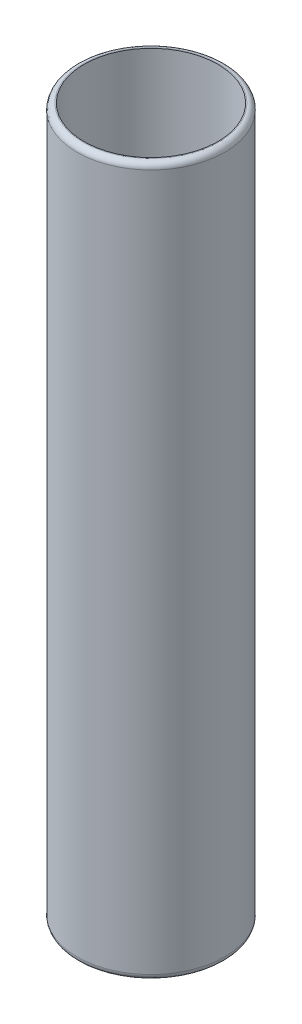
ISO-10303-21;
HEADER;
FILE_DESCRIPTION(('STEP AP214'),'2;1');
FILE_NAME('part.step','',(''),(''),'','','');
FILE_SCHEMA(('AUTOMOTIVE_DESIGN { 1 0 10303 214 1 1 1 1 }'));
ENDSEC;
DATA;
#1=APPLICATION_CONTEXT('core data for automotive mechanical design processes');
#2=APPLICATION_PROTOCOL_DEFINITION('international standard','automotive_design',2000,#1);
#3=PRODUCT_CONTEXT('',#1,'mechanical');
#4=PRODUCT('Part','Part','',(#3));
#5=PRODUCT_RELATED_PRODUCT_CATEGORY('part','',(#4));
#6=PRODUCT_DEFINITION_FORMATION('','',#4);
#7=PRODUCT_DEFINITION_CONTEXT('part definition',#1,'design');
#8=PRODUCT_DEFINITION('design','',#6,#7);
#9=PRODUCT_DEFINITION_SHAPE('','',#8);
#10=(LENGTH_UNIT() NAMED_UNIT(*) SI_UNIT(.MILLI.,.METRE.));
#11=(NAMED_UNIT(*) PLANE_ANGLE_UNIT() SI_UNIT($,.RADIAN.));
#12=(NAMED_UNIT(*) SI_UNIT($,.STERADIAN.) SOLID_ANGLE_UNIT());
#13=UNCERTAINTY_MEASURE_WITH_UNIT(LENGTH_MEASURE(1.E-05),#10,'distance_accuracy_value','');
#14=(GEOMETRIC_REPRESENTATION_CONTEXT(3) GLOBAL_UNCERTAINTY_ASSIGNED_CONTEXT((#13)) GLOBAL_UNIT_ASSIGNED_CONTEXT((#10,
#11,#12)) REPRESENTATION_CONTEXT('',''));
#15=CARTESIAN_POINT('',(0.,0.,0.));
#16=DIRECTION('',(0.,0.,1.));
#17=DIRECTION('',(1.,0.,0.));
#18=AXIS2_PLACEMENT_3D('',#15,#16,#17);
#19=CARTESIAN_POINT('',(0.,152.4,0.));
#20=DIRECTION('',(0.,1.,0.));
#21=DIRECTION('',(0.,0.,1.));
#22=AXIS2_PLACEMENT_3D('',#19,#20,#21);
#23=PLANE('',#22);
#24=CARTESIAN_POINT('',(0.,152.4,0.));
#25=DIRECTION('',(0.,1.,0.));
#26=DIRECTION('',(0.,0.,1.));
#27=AXIS2_PLACEMENT_3D('',#24,#25,#26);
#28=CIRCLE('',#27,14.605);
#29=CARTESIAN_POINT('',(0.,152.4,14.605));
#30=VERTEX_POINT('',#29);
#31=EDGE_CURVE('E59',#30,#30,#28,.T.);
#32=ORIENTED_EDGE('',*,*,#31,.T.);
#33=EDGE_LOOP('',(#32));
#34=FACE_BOUND('',#33,.T.);
#35=CARTESIAN_POINT('',(0.,152.4,0.));
#36=DIRECTION('',(0.,1.,0.));
#37=DIRECTION('',(0.,0.,1.));
#38=AXIS2_PLACEMENT_3D('',#35,#36,#37);
#39=CIRCLE('',#38,14.4018);
#40=CARTESIAN_POINT('',(0.,152.4,-14.4018));
#41=VERTEX_POINT('',#40);
#42=EDGE_CURVE('E65',#41,#41,#39,.T.);
#43=ORIENTED_EDGE('',*,*,#42,.F.);
#44=EDGE_LOOP('',(#43));
#45=FACE_BOUND('',#44,.T.);
#46=ADVANCED_FACE('F41',(#34,#45),#23,.T.);
#47=CARTESIAN_POINT('',(0.,0.,0.));
#48=DIRECTION('',(0.,1.,0.));
#49=DIRECTION('',(0.,0.,1.));
#50=AXIS2_PLACEMENT_3D('',#47,#48,#49);
#51=PLANE('',#50);
#52=CARTESIAN_POINT('',(0.,0.,0.));
#53=DIRECTION('',(0.,1.,0.));
#54=DIRECTION('',(0.,0.,1.));
#55=AXIS2_PLACEMENT_3D('',#52,#53,#54);
#56=CIRCLE('',#55,14.605);
#57=CARTESIAN_POINT('',(0.,0.,14.605));
#58=VERTEX_POINT('',#57);
#59=EDGE_CURVE('E10',#58,#58,#56,.F.);
#60=ORIENTED_EDGE('',*,*,#59,.T.);
#61=EDGE_LOOP('',(#60));
#62=FACE_BOUND('',#61,.T.);
#63=CARTESIAN_POINT('',(0.,0.,0.));
#64=DIRECTION('',(0.,1.,0.));
#65=DIRECTION('',(0.,0.,1.));
#66=AXIS2_PLACEMENT_3D('',#63,#64,#65);
#67=CIRCLE('',#66,14.4018);
#68=CARTESIAN_POINT('',(0.,0.,-14.4018));
#69=VERTEX_POINT('',#68);
#70=EDGE_CURVE('E66',#69,#69,#67,.T.);
#71=ORIENTED_EDGE('',*,*,#70,.T.);
#72=EDGE_LOOP('',(#71));
#73=FACE_BOUND('',#72,.T.);
#74=ADVANCED_FACE('F78',(#62,#73),#51,.F.);
#75=CARTESIAN_POINT('',(0.,152.4,0.));
#76=DIRECTION('',(0.,-1.,0.));
#77=DIRECTION('',(0.,0.,-1.));
#78=AXIS2_PLACEMENT_3D('',#75,#76,#77);
#79=CYLINDRICAL_SURFACE('',#78,15.875);
#80=CARTESIAN_POINT('',(0.,151.13,0.));
#81=DIRECTION('',(0.,1.,0.));
#82=DIRECTION('',(0.,0.,1.));
#83=AXIS2_PLACEMENT_3D('',#80,#81,#82);
#84=CIRCLE('',#83,15.875);
#85=CARTESIAN_POINT('',(0.,151.13,-15.875));
#86=VERTEX_POINT('',#85);
#87=EDGE_CURVE('E49',#86,#86,#84,.F.);
#88=CARTESIAN_POINT('',(0.,1.26999999999999,0.));
#89=DIRECTION('',(0.,1.,0.));
#90=DIRECTION('',(0.,0.,1.));
#91=AXIS2_PLACEMENT_3D('',#88,#89,#90);
#92=CIRCLE('',#91,15.875);
#93=CARTESIAN_POINT('',(0.,1.26999999999999,-15.875));
#94=VERTEX_POINT('',#93);
#95=EDGE_CURVE('E54',#94,#94,#92,.T.);
#96=CARTESIAN_POINT('',(0.,151.13,-15.875));
#97=CARTESIAN_POINT('',(0.,149.568958333333,-15.875));
#98=CARTESIAN_POINT('',(0.,148.007916666667,-15.875));
#99=CARTESIAN_POINT('',(0.,144.885833333333,-15.875));
#100=CARTESIAN_POINT('',(0.,143.324791666667,-15.875));
#101=CARTESIAN_POINT('',(0.,140.202708333333,-15.875));
#102=CARTESIAN_POINT('',(0.,138.641666666667,-15.875));
#103=CARTESIAN_POINT('',(0.,135.519583333333,-15.875));
#104=CARTESIAN_POINT('',(0.,133.958541666667,-15.875));
#105=CARTESIAN_POINT('',(0.,130.836458333333,-15.875));
#106=CARTESIAN_POINT('',(0.,129.275416666667,-15.875));
#107=CARTESIAN_POINT('',(0.,126.153333333333,-15.875));
#108=CARTESIAN_POINT('',(0.,124.592291666667,-15.875));
#109=CARTESIAN_POINT('',(0.,121.470208333333,-15.875));
#110=CARTESIAN_POINT('',(0.,119.909166666667,-15.875));
#111=CARTESIAN_POINT('',(0.,116.787083333333,-15.875));
#112=CARTESIAN_POINT('',(0.,115.226041666667,-15.875));
#113=CARTESIAN_POINT('',(0.,112.103958333333,-15.875));
#114=CARTESIAN_POINT('',(0.,110.542916666667,-15.875));
#115=CARTESIAN_POINT('',(0.,107.420833333333,-15.875));
#116=CARTESIAN_POINT('',(0.,105.859791666667,-15.875));
#117=CARTESIAN_POINT('',(0.,102.737708333333,-15.875));
#118=CARTESIAN_POINT('',(0.,101.176666666667,-15.875));
#119=CARTESIAN_POINT('',(0.,98.0545833333333,-15.875));
#120=CARTESIAN_POINT('',(0.,96.4935416666667,-15.875));
#121=CARTESIAN_POINT('',(0.,93.3714583333333,-15.875));
#122=CARTESIAN_POINT('',(0.,91.8104166666667,-15.875));
#123=CARTESIAN_POINT('',(0.,88.6883333333333,-15.875));
#124=CARTESIAN_POINT('',(0.,87.1272916666667,-15.875));
#125=CARTESIAN_POINT('',(0.,84.0052083333333,-15.875));
#126=CARTESIAN_POINT('',(0.,82.4441666666666,-15.875));
#127=CARTESIAN_POINT('',(0.,79.3220833333333,-15.875));
#128=CARTESIAN_POINT('',(0.,77.7610416666667,-15.875));
#129=CARTESIAN_POINT('',(0.,74.6389583333333,-15.875));
#130=CARTESIAN_POINT('',(0.,73.0779166666667,-15.875));
#131=CARTESIAN_POINT('',(0.,69.9558333333333,-15.875));
#132=CARTESIAN_POINT('',(0.,68.3947916666666,-15.875));
#133=CARTESIAN_POINT('',(0.,65.2727083333333,-15.875));
#134=CARTESIAN_POINT('',(0.,63.7116666666667,-15.875));
#135=CARTESIAN_POINT('',(0.,60.5895833333333,-15.875));
#136=CARTESIAN_POINT('',(0.,59.0285416666666,-15.875));
#137=CARTESIAN_POINT('',(0.,55.9064583333333,-15.875));
#138=CARTESIAN_POINT('',(0.,54.3454166666666,-15.875));
#139=CARTESIAN_POINT('',(0.,51.2233333333333,-15.875));
#140=CARTESIAN_POINT('',(0.,49.6622916666666,-15.875));
#141=CARTESIAN_POINT('',(0.,46.5402083333333,-15.875));
#142=CARTESIAN_POINT('',(0.,44.9791666666666,-15.875));
#143=CARTESIAN_POINT('',(0.,41.8570833333333,-15.875));
#144=CARTESIAN_POINT('',(0.,40.2960416666666,-15.875));
#145=CARTESIAN_POINT('',(0.,37.1739583333333,-15.875));
#146=CARTESIAN_POINT('',(0.,35.6129166666666,-15.875));
#147=CARTESIAN_POINT('',(0.,32.4908333333333,-15.875));
#148=CARTESIAN_POINT('',(0.,30.9297916666666,-15.875));
#149=CARTESIAN_POINT('',(0.,27.8077083333333,-15.875));
#150=CARTESIAN_POINT('',(0.,26.2466666666667,-15.875));
#151=CARTESIAN_POINT('',(0.,23.1245833333333,-15.875));
#152=CARTESIAN_POINT('',(0.,21.5635416666666,-15.875));
#153=CARTESIAN_POINT('',(0.,18.4414583333333,-15.875));
#154=CARTESIAN_POINT('',(0.,16.8804166666666,-15.875));
#155=CARTESIAN_POINT('',(0.,13.7583333333333,-15.875));
#156=CARTESIAN_POINT('',(0.,12.1972916666666,-15.875));
#157=CARTESIAN_POINT('',(0.,9.07520833333331,-15.875));
#158=CARTESIAN_POINT('',(0.,7.51416666666666,-15.875));
#159=CARTESIAN_POINT('',(0.,4.39208333333333,-15.875));
#160=CARTESIAN_POINT('',(0.,2.83104166666666,-15.875));
#161=CARTESIAN_POINT('',(0.,1.26999999999999,-15.875));
#162=B_SPLINE_CURVE_WITH_KNOTS('',3,(#96,#97,#98,#99,#100,#101,#102,#103,#104,#105,#106,#107,
#108,#109,#110,#111,#112,#113,#114,#115,#116,#117,#118,#119,#120,#121,#122,#123,#124,#125,#126,
#127,#128,#129,#130,#131,#132,#133,#134,#135,#136,#137,#138,#139,#140,#141,#142,#143,#144,#145,
#146,#147,#148,#149,#150,#151,#152,#153,#154,#155,#156,#157,#158,#159,#160,#161),.UNSPECIFIED.,
.F.,.F.,(4,2,2,2,2,2,2,2,2,2,2,2,2,2,2,2,2,2,2,2,2,2,2,2,2,2,2,2,2,2,2,2,4),(0.,
4.68312500000001,9.36625000000002,14.049375,18.7325,23.415625,28.09875,32.781875,37.465,
42.148125,46.83125,51.514375,56.1975,60.880625,65.56375,70.246875,74.93,79.613125,84.29625,
88.979375,93.6625,98.345625,103.02875,107.711875,112.395,117.078125,121.76125,126.444375,
131.1275,135.810625,140.49375,145.176875,149.86),.UNSPECIFIED.);
#163=EDGE_CURVE('BSEAM84',#86,#94,#162,.T.);
#164=ORIENTED_EDGE('',*,*,#87,.T.);
#165=ORIENTED_EDGE('',*,*,#95,.T.);
#166=ORIENTED_EDGE('',*,*,#163,.T.);
#167=ORIENTED_EDGE('',*,*,#163,.F.);
#168=EDGE_LOOP('',(#164,#166,#165,#167));
#169=FACE_BOUND('',#168,.T.);
#170=ADVANCED_FACE('F84',(#169),#79,.T.);
#171=CARTESIAN_POINT('',(0.,152.4,0.));
#172=DIRECTION('',(0.,-1.,0.));
#173=DIRECTION('',(0.,0.,-1.));
#174=AXIS2_PLACEMENT_3D('',#171,#172,#173);
#175=CYLINDRICAL_SURFACE('',#174,14.4018);
#176=CARTESIAN_POINT('',(0.,152.4,-14.4018));
#177=CARTESIAN_POINT('',(0.,150.8125,-14.4018));
#178=CARTESIAN_POINT('',(0.,149.225,-14.4018));
#179=CARTESIAN_POINT('',(0.,146.05,-14.4018));
#180=CARTESIAN_POINT('',(0.,144.4625,-14.4018));
#181=CARTESIAN_POINT('',(0.,141.2875,-14.4018));
#182=CARTESIAN_POINT('',(0.,139.7,-14.4018));
#183=CARTESIAN_POINT('',(0.,136.525,-14.4018));
#184=CARTESIAN_POINT('',(0.,134.9375,-14.4018));
#185=CARTESIAN_POINT('',(0.,131.7625,-14.4018));
#186=CARTESIAN_POINT('',(0.,130.175,-14.4018));
#187=CARTESIAN_POINT('',(0.,127.,-14.4018));
#188=CARTESIAN_POINT('',(0.,125.4125,-14.4018));
#189=CARTESIAN_POINT('',(0.,122.2375,-14.4018));
#190=CARTESIAN_POINT('',(0.,120.65,-14.4018));
#191=CARTESIAN_POINT('',(0.,117.475,-14.4018));
#192=CARTESIAN_POINT('',(0.,115.8875,-14.4018));
#193=CARTESIAN_POINT('',(0.,112.7125,-14.4018));
#194=CARTESIAN_POINT('',(0.,111.125,-14.4018));
#195=CARTESIAN_POINT('',(0.,107.95,-14.4018));
#196=CARTESIAN_POINT('',(0.,106.3625,-14.4018));
#197=CARTESIAN_POINT('',(0.,103.1875,-14.4018));
#198=CARTESIAN_POINT('',(0.,101.6,-14.4018));
#199=CARTESIAN_POINT('',(0.,98.425,-14.4018));
#200=CARTESIAN_POINT('',(0.,96.8375,-14.4018));
#201=CARTESIAN_POINT('',(0.,93.6625,-14.4018));
#202=CARTESIAN_POINT('',(0.,92.075,-14.4018));
#203=CARTESIAN_POINT('',(0.,88.9,-14.4018));
#204=CARTESIAN_POINT('',(0.,87.3125,-14.4018));
#205=CARTESIAN_POINT('',(0.,84.1375,-14.4018));
#206=CARTESIAN_POINT('',(0.,82.55,-14.4018));
#207=CARTESIAN_POINT('',(0.,79.375,-14.4018));
#208=CARTESIAN_POINT('',(0.,77.7875,-14.4018));
#209=CARTESIAN_POINT('',(0.,74.6125,-14.4018));
#210=CARTESIAN_POINT('',(0.,73.025,-14.4018));
#211=CARTESIAN_POINT('',(0.,69.85,-14.4018));
#212=CARTESIAN_POINT('',(0.,68.2625,-14.4018));
#213=CARTESIAN_POINT('',(0.,65.0875,-14.4018));
#214=CARTESIAN_POINT('',(0.,63.5,-14.4018));
#215=CARTESIAN_POINT('',(0.,60.325,-14.4018));
#216=CARTESIAN_POINT('',(0.,58.7375,-14.4018));
#217=CARTESIAN_POINT('',(0.,55.5625,-14.4018));
#218=CARTESIAN_POINT('',(0.,53.975,-14.4018));
#219=CARTESIAN_POINT('',(0.,50.8,-14.4018));
#220=CARTESIAN_POINT('',(0.,49.2125,-14.4018));
#221=CARTESIAN_POINT('',(0.,46.0375,-14.4018));
#222=CARTESIAN_POINT('',(0.,44.45,-14.4018));
#223=CARTESIAN_POINT('',(0.,41.275,-14.4018));
#224=CARTESIAN_POINT('',(0.,39.6875,-14.4018));
#225=CARTESIAN_POINT('',(0.,36.5125,-14.4018));
#226=CARTESIAN_POINT('',(0.,34.925,-14.4018));
#227=CARTESIAN_POINT('',(0.,31.75,-14.4018));
#228=CARTESIAN_POINT('',(0.,30.1625,-14.4018));
#229=CARTESIAN_POINT('',(0.,26.9875,-14.4018));
#230=CARTESIAN_POINT('',(0.,25.4,-14.4018));
#231=CARTESIAN_POINT('',(0.,22.225,-14.4018));
#232=CARTESIAN_POINT('',(0.,20.6375,-14.4018));
#233=CARTESIAN_POINT('',(0.,17.4625,-14.4018));
#234=CARTESIAN_POINT('',(0.,15.875,-14.4018));
#235=CARTESIAN_POINT('',(0.,12.7,-14.4018));
#236=CARTESIAN_POINT('',(0.,11.1125,-14.4018));
#237=CARTESIAN_POINT('',(0.,7.93750000000001,-14.4018));
#238=CARTESIAN_POINT('',(0.,6.35,-14.4018));
#239=CARTESIAN_POINT('',(0.,3.175,-14.4018));
#240=CARTESIAN_POINT('',(0.,1.5875,-14.4018));
#241=CARTESIAN_POINT('',(0.,0.,-14.4018));
#242=B_SPLINE_CURVE_WITH_KNOTS('',3,(#176,#177,#178,#179,#180,#181,#182,#183,#184,#185,#186,
#187,#188,#189,#190,#191,#192,#193,#194,#195,#196,#197,#198,#199,#200,#201,#202,#203,#204,#205,
#206,#207,#208,#209,#210,#211,#212,#213,#214,#215,#216,#217,#218,#219,#220,#221,#222,#223,#224,
#225,#226,#227,#228,#229,#230,#231,#232,#233,#234,#235,#236,#237,#238,#239,#240,#241),
.UNSPECIFIED.,.F.,.F.,(4,2,2,2,2,2,2,2,2,2,2,2,2,2,2,2,2,2,2,2,2,2,2,2,2,2,2,2,2,2,2,2,4),(0.,
4.76249999999998,9.52499999999998,14.2875,19.05,23.8125,28.575,33.3375,38.1,42.8625,47.625,
52.3875,57.15,61.9125,66.675,71.4375,76.2,80.9625,85.725,90.4875,95.25,100.0125,104.775,
109.5375,114.3,119.0625,123.825,128.5875,133.35,138.1125,142.875,147.6375,152.4),.UNSPECIFIED.);
#243=EDGE_CURVE('BSEAM74',#41,#69,#242,.T.);
#244=ORIENTED_EDGE('',*,*,#42,.T.);
#245=ORIENTED_EDGE('',*,*,#70,.F.);
#246=ORIENTED_EDGE('',*,*,#243,.T.);
#247=ORIENTED_EDGE('',*,*,#243,.F.);
#248=EDGE_LOOP('',(#244,#246,#245,#247));
#249=FACE_BOUND('',#248,.T.);
#250=ADVANCED_FACE('F74',(#249),#175,.F.);
#251=CARTESIAN_POINT('',(0.,151.13,0.));
#252=DIRECTION('',(0.,1.,0.));
#253=DIRECTION('',(0.,0.,1.));
#254=AXIS2_PLACEMENT_3D('',#251,#252,#253);
#255=TOROIDAL_SURFACE('',#254,14.605,1.27);
#256=ORIENTED_EDGE('',*,*,#87,.F.);
#257=EDGE_LOOP('',(#256));
#258=FACE_BOUND('',#257,.T.);
#259=ORIENTED_EDGE('',*,*,#31,.F.);
#260=EDGE_LOOP('',(#259));
#261=FACE_BOUND('',#260,.T.);
#262=ADVANCED_FACE('F89',(#258,#261),#255,.T.);
#263=CARTESIAN_POINT('',(0.,1.26999999999999,0.));
#264=DIRECTION('',(0.,1.,0.));
#265=DIRECTION('',(0.,0.,1.));
#266=AXIS2_PLACEMENT_3D('',#263,#264,#265);
#267=TOROIDAL_SURFACE('',#266,14.605,1.27);
#268=ORIENTED_EDGE('',*,*,#59,.F.);
#269=EDGE_LOOP('',(#268));
#270=FACE_BOUND('',#269,.T.);
#271=ORIENTED_EDGE('',*,*,#95,.F.);
#272=EDGE_LOOP('',(#271));
#273=FACE_BOUND('',#272,.T.);
#274=ADVANCED_FACE('F43',(#270,#273),#267,.T.);
#275=CLOSED_SHELL('',(#46,#74,#170,#250,#262,#274));
#276=MANIFOLD_SOLID_BREP('B2',#275);
#277=ADVANCED_BREP_SHAPE_REPRESENTATION('',(#18,#276),#14);
#278=SHAPE_DEFINITION_REPRESENTATION(#9,#277);
ENDSEC;
END-ISO-10303-21;
